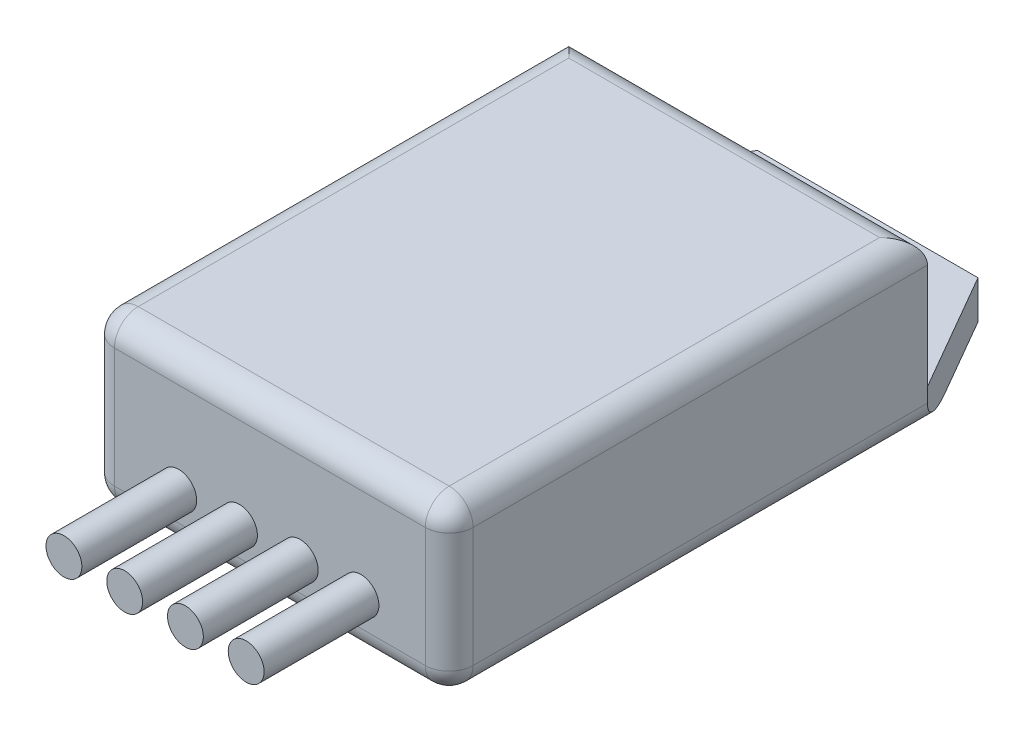
ISO-10303-21;
HEADER;
FILE_DESCRIPTION(('STEP AP214'),'2;1');
FILE_NAME('part.step','',(''),(''),'','','');
FILE_SCHEMA(('AUTOMOTIVE_DESIGN { 1 0 10303 214 1 1 1 1 }'));
ENDSEC;
DATA;
#1=APPLICATION_CONTEXT('core data for automotive mechanical design processes');
#2=APPLICATION_PROTOCOL_DEFINITION('international standard','automotive_design',2000,#1);
#3=PRODUCT_CONTEXT('',#1,'mechanical');
#4=PRODUCT('Part','Part','',(#3));
#5=PRODUCT_RELATED_PRODUCT_CATEGORY('part','',(#4));
#6=PRODUCT_DEFINITION_FORMATION('','',#4);
#7=PRODUCT_DEFINITION_CONTEXT('part definition',#1,'design');
#8=PRODUCT_DEFINITION('design','',#6,#7);
#9=PRODUCT_DEFINITION_SHAPE('','',#8);
#10=(LENGTH_UNIT() NAMED_UNIT(*) SI_UNIT(.MILLI.,.METRE.));
#11=(NAMED_UNIT(*) PLANE_ANGLE_UNIT() SI_UNIT($,.RADIAN.));
#12=(NAMED_UNIT(*) SI_UNIT($,.STERADIAN.) SOLID_ANGLE_UNIT());
#13=UNCERTAINTY_MEASURE_WITH_UNIT(LENGTH_MEASURE(1.E-05),#10,'distance_accuracy_value','');
#14=(GEOMETRIC_REPRESENTATION_CONTEXT(3) GLOBAL_UNCERTAINTY_ASSIGNED_CONTEXT((#13)) GLOBAL_UNIT_ASSIGNED_CONTEXT((#10,
#11,#12)) REPRESENTATION_CONTEXT('',''));
#15=CARTESIAN_POINT('',(0.,0.,0.));
#16=DIRECTION('',(0.,0.,1.));
#17=DIRECTION('',(1.,0.,0.));
#18=AXIS2_PLACEMENT_3D('',#15,#16,#17);
#19=CARTESIAN_POINT('',(-7.5,-0.2,6.7));
#20=DIRECTION('',(-1.,0.,0.));
#21=DIRECTION('',(0.,0.,1.));
#22=AXIS2_PLACEMENT_3D('',#19,#20,#21);
#23=PLANE('',#22);
#24=DIRECTION('',(0.,1.,0.));
#25=VECTOR('',#24,1.);
#26=CARTESIAN_POINT('',(-7.5,-0.2,5.7));
#27=LINE('',#26,#25);
#28=CARTESIAN_POINT('',(-7.5,0.8,5.7));
#29=VERTEX_POINT('',#28);
#30=CARTESIAN_POINT('',(-7.5,5.8,5.7));
#31=VERTEX_POINT('',#30);
#32=EDGE_CURVE('E239',#29,#31,#27,.T.);
#33=ORIENTED_EDGE('',*,*,#32,.T.);
#34=DIRECTION('',(0.,0.,1.));
#35=VECTOR('',#34,1.);
#36=CARTESIAN_POINT('',(-7.5,5.8,6.7));
#37=LINE('',#36,#35);
#38=CARTESIAN_POINT('',(-7.5,5.8,-13.3));
#39=VERTEX_POINT('',#38);
#40=EDGE_CURVE('E243',#31,#39,#37,.F.);
#41=ORIENTED_EDGE('',*,*,#40,.T.);
#42=DIRECTION('',(0.,1.,0.));
#43=VECTOR('',#42,1.);
#44=CARTESIAN_POINT('',(-7.5,-0.2,-13.3));
#45=LINE('',#44,#43);
#46=CARTESIAN_POINT('',(-7.5,1.4,-13.3));
#47=VERTEX_POINT('',#46);
#48=EDGE_CURVE('E141',#47,#39,#45,.T.);
#49=ORIENTED_EDGE('',*,*,#48,.F.);
#50=CARTESIAN_POINT('',(-7.5,0.8,-13.3));
#51=VERTEX_POINT('',#50);
#52=EDGE_CURVE('E189',#51,#47,#45,.T.);
#53=ORIENTED_EDGE('',*,*,#52,.F.);
#54=DIRECTION('',(0.,0.,1.));
#55=VECTOR('',#54,1.);
#56=CARTESIAN_POINT('',(-7.5,0.8,6.7));
#57=LINE('',#56,#55);
#58=EDGE_CURVE('E241',#51,#29,#57,.T.);
#59=ORIENTED_EDGE('',*,*,#58,.T.);
#60=EDGE_LOOP('',(#33,#41,#49,#53,#59));
#61=FACE_BOUND('',#60,.T.);
#62=ADVANCED_FACE('F37',(#61),#23,.T.);
#63=CARTESIAN_POINT('',(7.5,-0.2,-13.3));
#64=DIRECTION('',(0.,0.,-1.));
#65=DIRECTION('',(-1.,0.,0.));
#66=AXIS2_PLACEMENT_3D('',#63,#64,#65);
#67=PLANE('',#66);
#68=ORIENTED_EDGE('',*,*,#48,.T.);
#69=DIRECTION('',(-1.,0.,0.));
#70=VECTOR('',#69,1.);
#71=CARTESIAN_POINT('',(7.5,5.8,-13.3));
#72=LINE('',#71,#70);
#73=CARTESIAN_POINT('',(7.5,5.8,-13.3));
#74=VERTEX_POINT('',#73);
#75=EDGE_CURVE('E152',#39,#74,#72,.F.);
#76=ORIENTED_EDGE('',*,*,#75,.T.);
#77=DIRECTION('',(0.,1.,0.));
#78=VECTOR('',#77,1.);
#79=CARTESIAN_POINT('',(7.5,-0.2,-13.3));
#80=LINE('',#79,#78);
#81=CARTESIAN_POINT('',(7.5,1.4,-13.3));
#82=VERTEX_POINT('',#81);
#83=EDGE_CURVE('E135',#82,#74,#80,.T.);
#84=ORIENTED_EDGE('',*,*,#83,.F.);
#85=DIRECTION('',(1.,0.,0.));
#86=VECTOR('',#85,1.);
#87=CARTESIAN_POINT('',(-7.5,1.4,-13.3));
#88=LINE('',#87,#86);
#89=EDGE_CURVE('E149',#47,#82,#88,.T.);
#90=ORIENTED_EDGE('',*,*,#89,.F.);
#91=EDGE_LOOP('',(#68,#76,#84,#90));
#92=FACE_BOUND('',#91,.T.);
#93=ADVANCED_FACE('F147',(#92),#67,.T.);
#94=CARTESIAN_POINT('',(7.5,-0.2,6.7));
#95=DIRECTION('',(1.,0.,0.));
#96=DIRECTION('',(0.,0.,-1.));
#97=AXIS2_PLACEMENT_3D('',#94,#95,#96);
#98=PLANE('',#97);
#99=ORIENTED_EDGE('',*,*,#83,.T.);
#100=DIRECTION('',(0.,0.,-1.));
#101=VECTOR('',#100,1.);
#102=CARTESIAN_POINT('',(7.5,5.8,6.7));
#103=LINE('',#102,#101);
#104=CARTESIAN_POINT('',(7.5,5.8,5.7));
#105=VERTEX_POINT('',#104);
#106=EDGE_CURVE('E228',#74,#105,#103,.F.);
#107=ORIENTED_EDGE('',*,*,#106,.T.);
#108=DIRECTION('',(0.,1.,0.));
#109=VECTOR('',#108,1.);
#110=CARTESIAN_POINT('',(7.5,-0.2,5.7));
#111=LINE('',#110,#109);
#112=CARTESIAN_POINT('',(7.5,0.8,5.7));
#113=VERTEX_POINT('',#112);
#114=EDGE_CURVE('E225',#105,#113,#111,.F.);
#115=ORIENTED_EDGE('',*,*,#114,.T.);
#116=DIRECTION('',(0.,0.,-1.));
#117=VECTOR('',#116,1.);
#118=CARTESIAN_POINT('',(7.5,0.8,-13.3));
#119=LINE('',#118,#117);
#120=CARTESIAN_POINT('',(7.5,0.8,-13.3));
#121=VERTEX_POINT('',#120);
#122=EDGE_CURVE('E137',#113,#121,#119,.T.);
#123=ORIENTED_EDGE('',*,*,#122,.T.);
#124=EDGE_CURVE('E132',#121,#82,#80,.T.);
#125=ORIENTED_EDGE('',*,*,#124,.T.);
#126=EDGE_LOOP('',(#99,#107,#115,#123,#125));
#127=FACE_BOUND('',#126,.T.);
#128=ADVANCED_FACE('F134',(#127),#98,.T.);
#129=CARTESIAN_POINT('',(7.5,-0.2,6.7));
#130=DIRECTION('',(0.,0.,1.));
#131=DIRECTION('',(1.,0.,0.));
#132=AXIS2_PLACEMENT_3D('',#129,#130,#131);
#133=PLANE('',#132);
#134=DIRECTION('',(1.,0.,0.));
#135=VECTOR('',#134,1.);
#136=CARTESIAN_POINT('',(7.5,0.8,6.7));
#137=LINE('',#136,#135);
#138=CARTESIAN_POINT('',(-6.5,0.8,6.7));
#139=VERTEX_POINT('',#138);
#140=CARTESIAN_POINT('',(6.5,0.8,6.7));
#141=VERTEX_POINT('',#140);
#142=EDGE_CURVE('E232',#139,#141,#137,.T.);
#143=ORIENTED_EDGE('',*,*,#142,.T.);
#144=DIRECTION('',(0.,1.,0.));
#145=VECTOR('',#144,1.);
#146=CARTESIAN_POINT('',(6.5,-0.2,6.7));
#147=LINE('',#146,#145);
#148=CARTESIAN_POINT('',(6.5,5.8,6.7));
#149=VERTEX_POINT('',#148);
#150=EDGE_CURVE('E237',#141,#149,#147,.T.);
#151=ORIENTED_EDGE('',*,*,#150,.T.);
#152=DIRECTION('',(1.,0.,0.));
#153=VECTOR('',#152,1.);
#154=CARTESIAN_POINT('',(7.5,5.8,6.7));
#155=LINE('',#154,#153);
#156=CARTESIAN_POINT('',(-6.5,5.8,6.7));
#157=VERTEX_POINT('',#156);
#158=EDGE_CURVE('E234',#149,#157,#155,.F.);
#159=ORIENTED_EDGE('',*,*,#158,.T.);
#160=DIRECTION('',(0.,1.,0.));
#161=VECTOR('',#160,1.);
#162=CARTESIAN_POINT('',(-6.5,-0.2,6.7));
#163=LINE('',#162,#161);
#164=EDGE_CURVE('E230',#157,#139,#163,.F.);
#165=ORIENTED_EDGE('',*,*,#164,.T.);
#166=EDGE_LOOP('',(#143,#151,#159,#165));
#167=FACE_BOUND('',#166,.T.);
#168=CARTESIAN_POINT('',(3.81,2.,6.7));
#169=DIRECTION('',(0.,0.,1.));
#170=DIRECTION('',(1.,0.,0.));
#171=AXIS2_PLACEMENT_3D('',#168,#169,#170);
#172=CIRCLE('',#171,0.75);
#173=CARTESIAN_POINT('',(4.56,2.,6.7));
#174=VERTEX_POINT('',#173);
#175=EDGE_CURVE('E199',#174,#174,#172,.F.);
#176=ORIENTED_EDGE('',*,*,#175,.T.);
#177=EDGE_LOOP('',(#176));
#178=FACE_BOUND('',#177,.T.);
#179=CARTESIAN_POINT('',(1.27,2.,6.7));
#180=DIRECTION('',(0.,0.,1.));
#181=DIRECTION('',(1.,0.,0.));
#182=AXIS2_PLACEMENT_3D('',#179,#180,#181);
#183=CIRCLE('',#182,0.75);
#184=CARTESIAN_POINT('',(2.02,2.,6.7));
#185=VERTEX_POINT('',#184);
#186=EDGE_CURVE('E195',#185,#185,#183,.F.);
#187=ORIENTED_EDGE('',*,*,#186,.T.);
#188=EDGE_LOOP('',(#187));
#189=FACE_BOUND('',#188,.T.);
#190=CARTESIAN_POINT('',(-1.27,2.,6.7));
#191=DIRECTION('',(0.,0.,1.));
#192=DIRECTION('',(1.,0.,0.));
#193=AXIS2_PLACEMENT_3D('',#190,#191,#192);
#194=CIRCLE('',#193,0.75);
#195=CARTESIAN_POINT('',(-0.519999999999998,2.,6.7));
#196=VERTEX_POINT('',#195);
#197=EDGE_CURVE('E192',#196,#196,#194,.F.);
#198=ORIENTED_EDGE('',*,*,#197,.T.);
#199=EDGE_LOOP('',(#198));
#200=FACE_BOUND('',#199,.T.);
#201=CARTESIAN_POINT('',(-3.81,2.,6.7));
#202=DIRECTION('',(0.,0.,1.));
#203=DIRECTION('',(1.,0.,0.));
#204=AXIS2_PLACEMENT_3D('',#201,#202,#203);
#205=CIRCLE('',#204,0.75);
#206=CARTESIAN_POINT('',(-3.06,2.,6.7));
#207=VERTEX_POINT('',#206);
#208=EDGE_CURVE('E196',#207,#207,#205,.F.);
#209=ORIENTED_EDGE('',*,*,#208,.T.);
#210=EDGE_LOOP('',(#209));
#211=FACE_BOUND('',#210,.T.);
#212=ADVANCED_FACE('F298',(#167,#178,#189,#200,#211),#133,.T.);
#213=CARTESIAN_POINT('',(0.,-0.2,0.));
#214=DIRECTION('',(0.,1.,0.));
#215=DIRECTION('',(0.,0.,1.));
#216=AXIS2_PLACEMENT_3D('',#213,#214,#215);
#217=PLANE('',#216);
#218=DIRECTION('',(1.,0.,0.));
#219=VECTOR('',#218,1.);
#220=CARTESIAN_POINT('',(-7.5,-0.2,5.7));
#221=LINE('',#220,#219);
#222=CARTESIAN_POINT('',(6.5,-0.2,5.7));
#223=VERTEX_POINT('',#222);
#224=CARTESIAN_POINT('',(-6.5,-0.2,5.7));
#225=VERTEX_POINT('',#224);
#226=EDGE_CURVE('E54',#223,#225,#221,.F.);
#227=ORIENTED_EDGE('',*,*,#226,.T.);
#228=DIRECTION('',(0.,0.,1.));
#229=VECTOR('',#228,1.);
#230=CARTESIAN_POINT('',(-6.5,-0.2,-13.3));
#231=LINE('',#230,#229);
#232=CARTESIAN_POINT('',(-6.5,-0.2,-15.0320508075689));
#233=VERTEX_POINT('',#232);
#234=EDGE_CURVE('E247',#225,#233,#231,.F.);
#235=ORIENTED_EDGE('',*,*,#234,.T.);
#236=DIRECTION('',(-0.500000000000004,0.,0.866025403784436));
#237=VECTOR('',#236,1.);
#238=CARTESIAN_POINT('',(-7.5,-0.2,-13.3));
#239=LINE('',#238,#237);
#240=CARTESIAN_POINT('',(-4.61324865405184,-0.2,-18.3));
#241=VERTEX_POINT('',#240);
#242=EDGE_CURVE('E184',#241,#233,#239,.T.);
#243=ORIENTED_EDGE('',*,*,#242,.F.);
#244=DIRECTION('',(-1.,0.,0.));
#245=VECTOR('',#244,1.);
#246=CARTESIAN_POINT('',(-4.61324865405184,-0.2,-18.3));
#247=LINE('',#246,#245);
#248=CARTESIAN_POINT('',(4.61324865405184,-0.2,-18.3));
#249=VERTEX_POINT('',#248);
#250=EDGE_CURVE('E181',#249,#241,#247,.T.);
#251=ORIENTED_EDGE('',*,*,#250,.F.);
#252=DIRECTION('',(-0.500000000000004,0.,-0.866025403784436));
#253=VECTOR('',#252,1.);
#254=CARTESIAN_POINT('',(4.61324865405184,-0.2,-18.3));
#255=LINE('',#254,#253);
#256=CARTESIAN_POINT('',(6.5,-0.2,-15.0320508075689));
#257=VERTEX_POINT('',#256);
#258=EDGE_CURVE('E179',#257,#249,#255,.T.);
#259=ORIENTED_EDGE('',*,*,#258,.F.);
#260=DIRECTION('',(0.,0.,-1.));
#261=VECTOR('',#260,1.);
#262=CARTESIAN_POINT('',(6.5,-0.2,6.7));
#263=LINE('',#262,#261);
#264=EDGE_CURVE('E59',#257,#223,#263,.F.);
#265=ORIENTED_EDGE('',*,*,#264,.T.);
#266=EDGE_LOOP('',(#227,#235,#243,#251,#259,#265));
#267=FACE_BOUND('',#266,.T.);
#268=CARTESIAN_POINT('',(0.,-0.2,-15.8));
#269=DIRECTION('',(0.,1.,0.));
#270=DIRECTION('',(0.,0.,1.));
#271=AXIS2_PLACEMENT_3D('',#268,#269,#270);
#272=CIRCLE('',#271,1.5);
#273=CARTESIAN_POINT('',(0.,-0.2,-14.3));
#274=VERTEX_POINT('',#273);
#275=EDGE_CURVE('E176',#274,#274,#272,.T.);
#276=ORIENTED_EDGE('',*,*,#275,.T.);
#277=EDGE_LOOP('',(#276));
#278=FACE_BOUND('',#277,.T.);
#279=ADVANCED_FACE('F326',(#267,#278),#217,.F.);
#280=CARTESIAN_POINT('',(0.,6.8,0.));
#281=DIRECTION('',(0.,1.,0.));
#282=DIRECTION('',(0.,0.,1.));
#283=AXIS2_PLACEMENT_3D('',#280,#281,#282);
#284=PLANE('',#283);
#285=DIRECTION('',(0.,0.,-1.));
#286=VECTOR('',#285,1.);
#287=CARTESIAN_POINT('',(6.5,6.8,0.));
#288=LINE('',#287,#286);
#289=CARTESIAN_POINT('',(6.5,6.8,5.7));
#290=VERTEX_POINT('',#289);
#291=CARTESIAN_POINT('',(6.5,6.8,-12.3));
#292=VERTEX_POINT('',#291);
#293=EDGE_CURVE('E219',#290,#292,#288,.T.);
#294=ORIENTED_EDGE('',*,*,#293,.T.);
#295=DIRECTION('',(-1.,0.,0.));
#296=VECTOR('',#295,1.);
#297=CARTESIAN_POINT('',(0.,6.8,-12.3));
#298=LINE('',#297,#296);
#299=CARTESIAN_POINT('',(-6.5,6.8,-12.3));
#300=VERTEX_POINT('',#299);
#301=EDGE_CURVE('E221',#292,#300,#298,.T.);
#302=ORIENTED_EDGE('',*,*,#301,.T.);
#303=DIRECTION('',(0.,0.,1.));
#304=VECTOR('',#303,1.);
#305=CARTESIAN_POINT('',(-6.5,6.8,0.));
#306=LINE('',#305,#304);
#307=CARTESIAN_POINT('',(-6.5,6.8,5.7));
#308=VERTEX_POINT('',#307);
#309=EDGE_CURVE('E202',#300,#308,#306,.T.);
#310=ORIENTED_EDGE('',*,*,#309,.T.);
#311=DIRECTION('',(1.,0.,0.));
#312=VECTOR('',#311,1.);
#313=CARTESIAN_POINT('',(0.,6.8,5.7));
#314=LINE('',#313,#312);
#315=EDGE_CURVE('E217',#308,#290,#314,.T.);
#316=ORIENTED_EDGE('',*,*,#315,.T.);
#317=EDGE_LOOP('',(#294,#302,#310,#316));
#318=FACE_BOUND('',#317,.T.);
#319=ADVANCED_FACE('F373',(#318),#284,.T.);
#320=CARTESIAN_POINT('',(-3.81,2.,11.5));
#321=DIRECTION('',(0.,0.,1.));
#322=DIRECTION('',(1.,0.,0.));
#323=AXIS2_PLACEMENT_3D('',#320,#321,#322);
#324=PLANE('',#323);
#325=CARTESIAN_POINT('',(-3.81,2.,11.5));
#326=DIRECTION('',(0.,0.,-1.));
#327=DIRECTION('',(-1.,0.,0.));
#328=AXIS2_PLACEMENT_3D('',#325,#326,#327);
#329=CIRCLE('',#328,0.75);
#330=CARTESIAN_POINT('',(-4.56,2.,11.5));
#331=VERTEX_POINT('',#330);
#332=EDGE_CURVE('E203',#331,#331,#329,.T.);
#333=ORIENTED_EDGE('',*,*,#332,.F.);
#334=EDGE_LOOP('',(#333));
#335=FACE_BOUND('',#334,.T.);
#336=ADVANCED_FACE('F355',(#335),#324,.T.);
#337=CARTESIAN_POINT('',(-3.81,2.,11.5));
#338=DIRECTION('',(0.,0.,-1.));
#339=DIRECTION('',(-1.,0.,0.));
#340=AXIS2_PLACEMENT_3D('',#337,#338,#339);
#341=CYLINDRICAL_SURFACE('',#340,0.75);
#342=ORIENTED_EDGE('',*,*,#208,.F.);
#343=EDGE_LOOP('',(#342));
#344=FACE_BOUND('',#343,.T.);
#345=ORIENTED_EDGE('',*,*,#332,.T.);
#346=EDGE_LOOP('',(#345));
#347=FACE_BOUND('',#346,.T.);
#348=ADVANCED_FACE('F351',(#344,#347),#341,.T.);
#349=CARTESIAN_POINT('',(-1.27,2.,11.5));
#350=DIRECTION('',(0.,0.,1.));
#351=DIRECTION('',(1.,0.,0.));
#352=AXIS2_PLACEMENT_3D('',#349,#350,#351);
#353=PLANE('',#352);
#354=CARTESIAN_POINT('',(-1.27,2.,11.5));
#355=DIRECTION('',(0.,0.,-1.));
#356=DIRECTION('',(-1.,0.,0.));
#357=AXIS2_PLACEMENT_3D('',#354,#355,#356);
#358=CIRCLE('',#357,0.75);
#359=CARTESIAN_POINT('',(-2.02,2.,11.5));
#360=VERTEX_POINT('',#359);
#361=EDGE_CURVE('E206',#360,#360,#358,.T.);
#362=ORIENTED_EDGE('',*,*,#361,.F.);
#363=EDGE_LOOP('',(#362));
#364=FACE_BOUND('',#363,.T.);
#365=ADVANCED_FACE('F354',(#364),#353,.T.);
#366=CARTESIAN_POINT('',(-1.27,2.,11.5));
#367=DIRECTION('',(0.,0.,-1.));
#368=DIRECTION('',(-1.,0.,0.));
#369=AXIS2_PLACEMENT_3D('',#366,#367,#368);
#370=CYLINDRICAL_SURFACE('',#369,0.75);
#371=ORIENTED_EDGE('',*,*,#197,.F.);
#372=EDGE_LOOP('',(#371));
#373=FACE_BOUND('',#372,.T.);
#374=ORIENTED_EDGE('',*,*,#361,.T.);
#375=EDGE_LOOP('',(#374));
#376=FACE_BOUND('',#375,.T.);
#377=ADVANCED_FACE('F357',(#373,#376),#370,.T.);
#378=CARTESIAN_POINT('',(1.27,2.,11.5));
#379=DIRECTION('',(0.,0.,1.));
#380=DIRECTION('',(1.,0.,0.));
#381=AXIS2_PLACEMENT_3D('',#378,#379,#380);
#382=PLANE('',#381);
#383=CARTESIAN_POINT('',(1.27,2.,11.5));
#384=DIRECTION('',(0.,0.,-1.));
#385=DIRECTION('',(-1.,0.,0.));
#386=AXIS2_PLACEMENT_3D('',#383,#384,#385);
#387=CIRCLE('',#386,0.75);
#388=CARTESIAN_POINT('',(0.520000000000003,2.,11.5));
#389=VERTEX_POINT('',#388);
#390=EDGE_CURVE('E209',#389,#389,#387,.T.);
#391=ORIENTED_EDGE('',*,*,#390,.F.);
#392=EDGE_LOOP('',(#391));
#393=FACE_BOUND('',#392,.T.);
#394=ADVANCED_FACE('F360',(#393),#382,.T.);
#395=CARTESIAN_POINT('',(1.27,2.,11.5));
#396=DIRECTION('',(0.,0.,-1.));
#397=DIRECTION('',(-1.,0.,0.));
#398=AXIS2_PLACEMENT_3D('',#395,#396,#397);
#399=CYLINDRICAL_SURFACE('',#398,0.75);
#400=ORIENTED_EDGE('',*,*,#186,.F.);
#401=EDGE_LOOP('',(#400));
#402=FACE_BOUND('',#401,.T.);
#403=ORIENTED_EDGE('',*,*,#390,.T.);
#404=EDGE_LOOP('',(#403));
#405=FACE_BOUND('',#404,.T.);
#406=ADVANCED_FACE('F362',(#402,#405),#399,.T.);
#407=CARTESIAN_POINT('',(3.81,2.,11.5));
#408=DIRECTION('',(0.,0.,1.));
#409=DIRECTION('',(1.,0.,0.));
#410=AXIS2_PLACEMENT_3D('',#407,#408,#409);
#411=PLANE('',#410);
#412=CARTESIAN_POINT('',(3.81,2.,11.5));
#413=DIRECTION('',(0.,0.,-1.));
#414=DIRECTION('',(-1.,0.,0.));
#415=AXIS2_PLACEMENT_3D('',#412,#413,#414);
#416=CIRCLE('',#415,0.75);
#417=CARTESIAN_POINT('',(3.06,2.,11.5));
#418=VERTEX_POINT('',#417);
#419=EDGE_CURVE('E190',#418,#418,#416,.T.);
#420=ORIENTED_EDGE('',*,*,#419,.F.);
#421=EDGE_LOOP('',(#420));
#422=FACE_BOUND('',#421,.T.);
#423=ADVANCED_FACE('F365',(#422),#411,.T.);
#424=CARTESIAN_POINT('',(3.81,2.,11.5));
#425=DIRECTION('',(0.,0.,-1.));
#426=DIRECTION('',(-1.,0.,0.));
#427=AXIS2_PLACEMENT_3D('',#424,#425,#426);
#428=CYLINDRICAL_SURFACE('',#427,0.75);
#429=ORIENTED_EDGE('',*,*,#175,.F.);
#430=EDGE_LOOP('',(#429));
#431=FACE_BOUND('',#430,.T.);
#432=ORIENTED_EDGE('',*,*,#419,.T.);
#433=EDGE_LOOP('',(#432));
#434=FACE_BOUND('',#433,.T.);
#435=ADVANCED_FACE('F367',(#431,#434),#428,.T.);
#436=CARTESIAN_POINT('',(-7.5,-0.2,-13.3));
#437=DIRECTION('',(-0.866025403784436,0.,-0.500000000000004));
#438=DIRECTION('',(-0.500000000000004,0.,0.866025403784436));
#439=AXIS2_PLACEMENT_3D('',#436,#437,#438);
#440=PLANE('',#439);
#441=ORIENTED_EDGE('',*,*,#242,.T.);
#442=CARTESIAN_POINT('',(-6.5,0.8,-15.0320508075689));
#443=DIRECTION('',(-0.866025403784436,0.,-0.500000000000004));
#444=DIRECTION('',(0.500000000000004,0.,-0.866025403784436));
#445=AXIS2_PLACEMENT_3D('',#442,#443,#444);
#446=ELLIPSE('',#445,1.99999999999998,1.);
#447=EDGE_CURVE('E46',#233,#51,#446,.T.);
#448=ORIENTED_EDGE('',*,*,#447,.T.);
#449=ORIENTED_EDGE('',*,*,#52,.T.);
#450=DIRECTION('',(-0.500000000000004,0.,0.866025403784436));
#451=VECTOR('',#450,1.);
#452=CARTESIAN_POINT('',(-7.5,1.4,-13.3));
#453=LINE('',#452,#451);
#454=CARTESIAN_POINT('',(-4.61324865405184,1.4,-18.3));
#455=VERTEX_POINT('',#454);
#456=EDGE_CURVE('E168',#455,#47,#453,.T.);
#457=ORIENTED_EDGE('',*,*,#456,.F.);
#458=DIRECTION('',(0.,1.,0.));
#459=VECTOR('',#458,1.);
#460=CARTESIAN_POINT('',(-4.61324865405184,-0.2,-18.3));
#461=LINE('',#460,#459);
#462=EDGE_CURVE('E153',#241,#455,#461,.T.);
#463=ORIENTED_EDGE('',*,*,#462,.F.);
#464=EDGE_LOOP('',(#441,#448,#449,#457,#463));
#465=FACE_BOUND('',#464,.T.);
#466=ADVANCED_FACE('F330',(#465),#440,.T.);
#467=CARTESIAN_POINT('',(-4.61324865405184,-0.2,-18.3));
#468=DIRECTION('',(0.,0.,-1.));
#469=DIRECTION('',(-1.,0.,0.));
#470=AXIS2_PLACEMENT_3D('',#467,#468,#469);
#471=PLANE('',#470);
#472=ORIENTED_EDGE('',*,*,#462,.T.);
#473=DIRECTION('',(-1.,0.,0.));
#474=VECTOR('',#473,1.);
#475=CARTESIAN_POINT('',(-4.61324865405184,1.4,-18.3));
#476=LINE('',#475,#474);
#477=CARTESIAN_POINT('',(4.61324865405184,1.4,-18.3));
#478=VERTEX_POINT('',#477);
#479=EDGE_CURVE('E162',#478,#455,#476,.T.);
#480=ORIENTED_EDGE('',*,*,#479,.F.);
#481=DIRECTION('',(0.,1.,0.));
#482=VECTOR('',#481,1.);
#483=CARTESIAN_POINT('',(4.61324865405184,-0.2,-18.3));
#484=LINE('',#483,#482);
#485=EDGE_CURVE('E158',#249,#478,#484,.T.);
#486=ORIENTED_EDGE('',*,*,#485,.F.);
#487=ORIENTED_EDGE('',*,*,#250,.T.);
#488=EDGE_LOOP('',(#472,#480,#486,#487));
#489=FACE_BOUND('',#488,.T.);
#490=ADVANCED_FACE('F333',(#489),#471,.T.);
#491=CARTESIAN_POINT('',(4.61324865405184,-0.2,-18.3));
#492=DIRECTION('',(0.866025403784436,0.,-0.500000000000004));
#493=DIRECTION('',(-0.500000000000004,0.,-0.866025403784436));
#494=AXIS2_PLACEMENT_3D('',#491,#492,#493);
#495=PLANE('',#494);
#496=ORIENTED_EDGE('',*,*,#124,.F.);
#497=CARTESIAN_POINT('',(6.5,0.8,-15.0320508075689));
#498=DIRECTION('',(0.866025403784436,0.,-0.500000000000004));
#499=DIRECTION('',(0.500000000000004,0.,0.866025403784436));
#500=AXIS2_PLACEMENT_3D('',#497,#498,#499);
#501=ELLIPSE('',#500,1.99999999999998,1.);
#502=EDGE_CURVE('E11',#121,#257,#501,.T.);
#503=ORIENTED_EDGE('',*,*,#502,.T.);
#504=ORIENTED_EDGE('',*,*,#258,.T.);
#505=ORIENTED_EDGE('',*,*,#485,.T.);
#506=DIRECTION('',(-0.500000000000004,0.,-0.866025403784436));
#507=VECTOR('',#506,1.);
#508=CARTESIAN_POINT('',(4.61324865405184,1.4,-18.3));
#509=LINE('',#508,#507);
#510=EDGE_CURVE('E155',#82,#478,#509,.T.);
#511=ORIENTED_EDGE('',*,*,#510,.F.);
#512=EDGE_LOOP('',(#496,#503,#504,#505,#511));
#513=FACE_BOUND('',#512,.T.);
#514=ADVANCED_FACE('F156',(#513),#495,.T.);
#515=CARTESIAN_POINT('',(0.,-0.2,-15.8));
#516=DIRECTION('',(0.,1.,0.));
#517=DIRECTION('',(0.,0.,1.));
#518=AXIS2_PLACEMENT_3D('',#515,#516,#517);
#519=CYLINDRICAL_SURFACE('',#518,1.5);
#520=ORIENTED_EDGE('',*,*,#275,.F.);
#521=EDGE_LOOP('',(#520));
#522=FACE_BOUND('',#521,.T.);
#523=CARTESIAN_POINT('',(0.,1.4,-15.8));
#524=DIRECTION('',(0.,1.,0.));
#525=DIRECTION('',(0.,0.,1.));
#526=AXIS2_PLACEMENT_3D('',#523,#524,#525);
#527=CIRCLE('',#526,1.5);
#528=CARTESIAN_POINT('',(0.,1.4,-14.3));
#529=VERTEX_POINT('',#528);
#530=EDGE_CURVE('E169',#529,#529,#527,.T.);
#531=ORIENTED_EDGE('',*,*,#530,.T.);
#532=EDGE_LOOP('',(#531));
#533=FACE_BOUND('',#532,.T.);
#534=ADVANCED_FACE('F339',(#522,#533),#519,.F.);
#535=CARTESIAN_POINT('',(0.,1.4,0.));
#536=DIRECTION('',(0.,-1.,0.));
#537=DIRECTION('',(0.,0.,-1.));
#538=AXIS2_PLACEMENT_3D('',#535,#536,#537);
#539=PLANE('',#538);
#540=ORIENTED_EDGE('',*,*,#89,.T.);
#541=ORIENTED_EDGE('',*,*,#510,.T.);
#542=ORIENTED_EDGE('',*,*,#479,.T.);
#543=ORIENTED_EDGE('',*,*,#456,.T.);
#544=EDGE_LOOP('',(#540,#541,#542,#543));
#545=FACE_BOUND('',#544,.T.);
#546=ORIENTED_EDGE('',*,*,#530,.F.);
#547=EDGE_LOOP('',(#546));
#548=FACE_BOUND('',#547,.T.);
#549=ADVANCED_FACE('F165',(#545,#548),#539,.F.);
#550=CARTESIAN_POINT('',(6.5,0.8,6.7));
#551=DIRECTION('',(0.,0.,1.));
#552=DIRECTION('',(1.,0.,0.));
#553=AXIS2_PLACEMENT_3D('',#550,#551,#552);
#554=CYLINDRICAL_SURFACE('',#553,1.);
#555=ORIENTED_EDGE('',*,*,#502,.F.);
#556=ORIENTED_EDGE('',*,*,#122,.F.);
#557=CARTESIAN_POINT('',(6.5,0.8,5.7));
#558=DIRECTION('',(0.,0.,1.));
#559=DIRECTION('',(1.,0.,0.));
#560=AXIS2_PLACEMENT_3D('',#557,#558,#559);
#561=CIRCLE('',#560,1.);
#562=EDGE_CURVE('E41',#223,#113,#561,.T.);
#563=ORIENTED_EDGE('',*,*,#562,.F.);
#564=ORIENTED_EDGE('',*,*,#264,.F.);
#565=EDGE_LOOP('',(#555,#556,#563,#564));
#566=FACE_BOUND('',#565,.T.);
#567=ADVANCED_FACE('F39',(#566),#554,.T.);
#568=CARTESIAN_POINT('',(7.5,0.8,5.7));
#569=DIRECTION('',(-1.,0.,0.));
#570=DIRECTION('',(0.,0.,1.));
#571=AXIS2_PLACEMENT_3D('',#568,#569,#570);
#572=CYLINDRICAL_SURFACE('',#571,1.);
#573=CARTESIAN_POINT('',(-6.5,0.8,5.7));
#574=DIRECTION('',(-1.,0.,0.));
#575=DIRECTION('',(0.,0.,1.));
#576=AXIS2_PLACEMENT_3D('',#573,#574,#575);
#577=CIRCLE('',#576,1.);
#578=EDGE_CURVE('E280',#225,#139,#577,.T.);
#579=ORIENTED_EDGE('',*,*,#578,.F.);
#580=ORIENTED_EDGE('',*,*,#226,.F.);
#581=CARTESIAN_POINT('',(6.5,0.8,5.7));
#582=DIRECTION('',(1.,0.,0.));
#583=DIRECTION('',(0.,0.,-1.));
#584=AXIS2_PLACEMENT_3D('',#581,#582,#583);
#585=CIRCLE('',#584,1.);
#586=EDGE_CURVE('E282',#141,#223,#585,.T.);
#587=ORIENTED_EDGE('',*,*,#586,.F.);
#588=ORIENTED_EDGE('',*,*,#142,.F.);
#589=EDGE_LOOP('',(#579,#580,#587,#588));
#590=FACE_BOUND('',#589,.T.);
#591=ADVANCED_FACE('F317',(#590),#572,.T.);
#592=CARTESIAN_POINT('',(-6.5,0.8,6.7));
#593=DIRECTION('',(0.,0.,-1.));
#594=DIRECTION('',(-1.,0.,0.));
#595=AXIS2_PLACEMENT_3D('',#592,#593,#594);
#596=CYLINDRICAL_SURFACE('',#595,1.);
#597=ORIENTED_EDGE('',*,*,#447,.F.);
#598=ORIENTED_EDGE('',*,*,#234,.F.);
#599=CARTESIAN_POINT('',(-6.5,0.8,5.7));
#600=DIRECTION('',(0.,0.,1.));
#601=DIRECTION('',(1.,0.,0.));
#602=AXIS2_PLACEMENT_3D('',#599,#600,#601);
#603=CIRCLE('',#602,1.);
#604=EDGE_CURVE('E277',#29,#225,#603,.T.);
#605=ORIENTED_EDGE('',*,*,#604,.F.);
#606=ORIENTED_EDGE('',*,*,#58,.F.);
#607=EDGE_LOOP('',(#597,#598,#605,#606));
#608=FACE_BOUND('',#607,.T.);
#609=ADVANCED_FACE('F324',(#608),#596,.T.);
#610=CARTESIAN_POINT('',(6.5,0.8,5.7));
#611=DIRECTION('',(0.,0.,1.));
#612=DIRECTION('',(1.,0.,0.));
#613=AXIS2_PLACEMENT_3D('',#610,#611,#612);
#614=SPHERICAL_SURFACE('',#613,1.);
#615=ORIENTED_EDGE('',*,*,#586,.T.);
#616=ORIENTED_EDGE('',*,*,#562,.T.);
#617=CARTESIAN_POINT('',(6.5,0.8,5.7));
#618=DIRECTION('',(0.,-1.,0.));
#619=DIRECTION('',(0.,0.,-1.));
#620=AXIS2_PLACEMENT_3D('',#617,#618,#619);
#621=CIRCLE('',#620,1.);
#622=EDGE_CURVE('E274',#141,#113,#621,.F.);
#623=ORIENTED_EDGE('',*,*,#622,.F.);
#624=EDGE_LOOP('',(#615,#616,#623));
#625=FACE_BOUND('',#624,.T.);
#626=ADVANCED_FACE('F289',(#625),#614,.T.);
#627=CARTESIAN_POINT('',(-6.5,0.8,5.7));
#628=DIRECTION('',(0.,0.,1.));
#629=DIRECTION('',(1.,0.,0.));
#630=AXIS2_PLACEMENT_3D('',#627,#628,#629);
#631=SPHERICAL_SURFACE('',#630,1.);
#632=ORIENTED_EDGE('',*,*,#604,.T.);
#633=ORIENTED_EDGE('',*,*,#578,.T.);
#634=CARTESIAN_POINT('',(-6.5,0.8,5.7));
#635=DIRECTION('',(0.,-1.,0.));
#636=DIRECTION('',(0.,0.,-1.));
#637=AXIS2_PLACEMENT_3D('',#634,#635,#636);
#638=CIRCLE('',#637,1.);
#639=EDGE_CURVE('E271',#29,#139,#638,.F.);
#640=ORIENTED_EDGE('',*,*,#639,.F.);
#641=EDGE_LOOP('',(#632,#633,#640));
#642=FACE_BOUND('',#641,.T.);
#643=ADVANCED_FACE('F319',(#642),#631,.T.);
#644=CARTESIAN_POINT('',(6.5,-0.2,5.7));
#645=DIRECTION('',(0.,1.,0.));
#646=DIRECTION('',(0.,0.,1.));
#647=AXIS2_PLACEMENT_3D('',#644,#645,#646);
#648=CYLINDRICAL_SURFACE('',#647,1.);
#649=ORIENTED_EDGE('',*,*,#622,.T.);
#650=ORIENTED_EDGE('',*,*,#114,.F.);
#651=CARTESIAN_POINT('',(6.5,5.8,5.7));
#652=DIRECTION('',(0.,1.,0.));
#653=DIRECTION('',(0.,0.,1.));
#654=AXIS2_PLACEMENT_3D('',#651,#652,#653);
#655=CIRCLE('',#654,1.);
#656=EDGE_CURVE('E268',#149,#105,#655,.T.);
#657=ORIENTED_EDGE('',*,*,#656,.F.);
#658=ORIENTED_EDGE('',*,*,#150,.F.);
#659=EDGE_LOOP('',(#649,#650,#657,#658));
#660=FACE_BOUND('',#659,.T.);
#661=ADVANCED_FACE('F294',(#660),#648,.T.);
#662=CARTESIAN_POINT('',(0.,5.8,5.7));
#663=DIRECTION('',(1.,0.,0.));
#664=DIRECTION('',(0.,0.,-1.));
#665=AXIS2_PLACEMENT_3D('',#662,#663,#664);
#666=CYLINDRICAL_SURFACE('',#665,1.);
#667=CARTESIAN_POINT('',(-6.5,5.8,5.7));
#668=DIRECTION('',(-1.,0.,0.));
#669=DIRECTION('',(0.,0.,1.));
#670=AXIS2_PLACEMENT_3D('',#667,#668,#669);
#671=CIRCLE('',#670,1.);
#672=EDGE_CURVE('E262',#157,#308,#671,.T.);
#673=ORIENTED_EDGE('',*,*,#672,.F.);
#674=ORIENTED_EDGE('',*,*,#158,.F.);
#675=CARTESIAN_POINT('',(6.5,5.8,5.7));
#676=DIRECTION('',(1.,0.,0.));
#677=DIRECTION('',(0.,0.,-1.));
#678=AXIS2_PLACEMENT_3D('',#675,#676,#677);
#679=CIRCLE('',#678,1.);
#680=EDGE_CURVE('E265',#290,#149,#679,.T.);
#681=ORIENTED_EDGE('',*,*,#680,.F.);
#682=ORIENTED_EDGE('',*,*,#315,.F.);
#683=EDGE_LOOP('',(#673,#674,#681,#682));
#684=FACE_BOUND('',#683,.T.);
#685=ADVANCED_FACE('F304',(#684),#666,.T.);
#686=CARTESIAN_POINT('',(-6.5,-0.2,5.7));
#687=DIRECTION('',(0.,1.,0.));
#688=DIRECTION('',(0.,0.,1.));
#689=AXIS2_PLACEMENT_3D('',#686,#687,#688);
#690=CYLINDRICAL_SURFACE('',#689,1.);
#691=ORIENTED_EDGE('',*,*,#639,.T.);
#692=ORIENTED_EDGE('',*,*,#164,.F.);
#693=CARTESIAN_POINT('',(-6.5,5.8,5.7));
#694=DIRECTION('',(0.,1.,0.));
#695=DIRECTION('',(0.,0.,1.));
#696=AXIS2_PLACEMENT_3D('',#693,#694,#695);
#697=CIRCLE('',#696,1.);
#698=EDGE_CURVE('E260',#31,#157,#697,.T.);
#699=ORIENTED_EDGE('',*,*,#698,.F.);
#700=ORIENTED_EDGE('',*,*,#32,.F.);
#701=EDGE_LOOP('',(#691,#692,#699,#700));
#702=FACE_BOUND('',#701,.T.);
#703=ADVANCED_FACE('F312',(#702),#690,.T.);
#704=CARTESIAN_POINT('',(6.5,5.8,5.7));
#705=DIRECTION('',(0.,0.,1.));
#706=DIRECTION('',(1.,0.,0.));
#707=AXIS2_PLACEMENT_3D('',#704,#705,#706);
#708=SPHERICAL_SURFACE('',#707,1.);
#709=ORIENTED_EDGE('',*,*,#680,.T.);
#710=ORIENTED_EDGE('',*,*,#656,.T.);
#711=CARTESIAN_POINT('',(6.5,5.8,5.7));
#712=DIRECTION('',(0.,0.,1.));
#713=DIRECTION('',(1.,0.,0.));
#714=AXIS2_PLACEMENT_3D('',#711,#712,#713);
#715=CIRCLE('',#714,1.);
#716=EDGE_CURVE('E257',#290,#105,#715,.F.);
#717=ORIENTED_EDGE('',*,*,#716,.F.);
#718=EDGE_LOOP('',(#709,#710,#717));
#719=FACE_BOUND('',#718,.T.);
#720=ADVANCED_FACE('F399',(#719),#708,.T.);
#721=CARTESIAN_POINT('',(-6.5,5.8,5.7));
#722=DIRECTION('',(0.,0.,1.));
#723=DIRECTION('',(1.,0.,0.));
#724=AXIS2_PLACEMENT_3D('',#721,#722,#723);
#725=SPHERICAL_SURFACE('',#724,1.);
#726=ORIENTED_EDGE('',*,*,#698,.T.);
#727=ORIENTED_EDGE('',*,*,#672,.T.);
#728=CARTESIAN_POINT('',(-6.5,5.8,5.7));
#729=DIRECTION('',(0.,0.,1.));
#730=DIRECTION('',(1.,0.,0.));
#731=AXIS2_PLACEMENT_3D('',#728,#729,#730);
#732=CIRCLE('',#731,1.);
#733=EDGE_CURVE('E254',#31,#308,#732,.F.);
#734=ORIENTED_EDGE('',*,*,#733,.F.);
#735=EDGE_LOOP('',(#726,#727,#734));
#736=FACE_BOUND('',#735,.T.);
#737=ADVANCED_FACE('F395',(#736),#725,.T.);
#738=CARTESIAN_POINT('',(6.5,5.8,0.));
#739=DIRECTION('',(0.,0.,-1.));
#740=DIRECTION('',(-1.,0.,0.));
#741=AXIS2_PLACEMENT_3D('',#738,#739,#740);
#742=CYLINDRICAL_SURFACE('',#741,1.);
#743=ORIENTED_EDGE('',*,*,#716,.T.);
#744=ORIENTED_EDGE('',*,*,#106,.F.);
#745=CARTESIAN_POINT('',(6.5,5.8,-12.3));
#746=DIRECTION('',(-0.707106781186548,0.,-0.707106781186547));
#747=DIRECTION('',(0.707106781186547,0.,-0.707106781186548));
#748=AXIS2_PLACEMENT_3D('',#745,#746,#747);
#749=ELLIPSE('',#748,1.4142135623731,1.);
#750=EDGE_CURVE('E252',#292,#74,#749,.T.);
#751=ORIENTED_EDGE('',*,*,#750,.F.);
#752=ORIENTED_EDGE('',*,*,#293,.F.);
#753=EDGE_LOOP('',(#743,#744,#751,#752));
#754=FACE_BOUND('',#753,.T.);
#755=ADVANCED_FACE('F391',(#754),#742,.T.);
#756=CARTESIAN_POINT('',(-6.5,5.8,0.));
#757=DIRECTION('',(0.,0.,1.));
#758=DIRECTION('',(1.,0.,0.));
#759=AXIS2_PLACEMENT_3D('',#756,#757,#758);
#760=CYLINDRICAL_SURFACE('',#759,1.);
#761=ORIENTED_EDGE('',*,*,#733,.T.);
#762=ORIENTED_EDGE('',*,*,#309,.F.);
#763=CARTESIAN_POINT('',(-6.5,5.8,-12.3));
#764=DIRECTION('',(-0.707106781186547,0.,0.707106781186548));
#765=DIRECTION('',(0.707106781186548,0.,0.707106781186547));
#766=AXIS2_PLACEMENT_3D('',#763,#764,#765);
#767=ELLIPSE('',#766,1.41421356237309,1.);
#768=EDGE_CURVE('E250',#39,#300,#767,.F.);
#769=ORIENTED_EDGE('',*,*,#768,.F.);
#770=ORIENTED_EDGE('',*,*,#40,.F.);
#771=EDGE_LOOP('',(#761,#762,#769,#770));
#772=FACE_BOUND('',#771,.T.);
#773=ADVANCED_FACE('F387',(#772),#760,.T.);
#774=CARTESIAN_POINT('',(0.,5.8,-12.3));
#775=DIRECTION('',(-1.,0.,0.));
#776=DIRECTION('',(0.,0.,1.));
#777=AXIS2_PLACEMENT_3D('',#774,#775,#776);
#778=CYLINDRICAL_SURFACE('',#777,1.);
#779=ORIENTED_EDGE('',*,*,#750,.T.);
#780=ORIENTED_EDGE('',*,*,#75,.F.);
#781=ORIENTED_EDGE('',*,*,#768,.T.);
#782=ORIENTED_EDGE('',*,*,#301,.F.);
#783=EDGE_LOOP('',(#779,#780,#781,#782));
#784=FACE_BOUND('',#783,.T.);
#785=ADVANCED_FACE('F384',(#784),#778,.T.);
#786=CLOSED_SHELL('',(#62,#93,#128,#212,#279,#319,#336,#348,#365,#377,#394,#406,#423,#435,#466,
#490,#514,#534,#549,#567,#591,#609,#626,#643,#661,#685,#703,#720,#737,#755,#773,#785));
#787=MANIFOLD_SOLID_BREP('B2',#786);
#788=ADVANCED_BREP_SHAPE_REPRESENTATION('',(#18,#787),#14);
#789=SHAPE_DEFINITION_REPRESENTATION(#9,#788);
ENDSEC;
END-ISO-10303-21;
